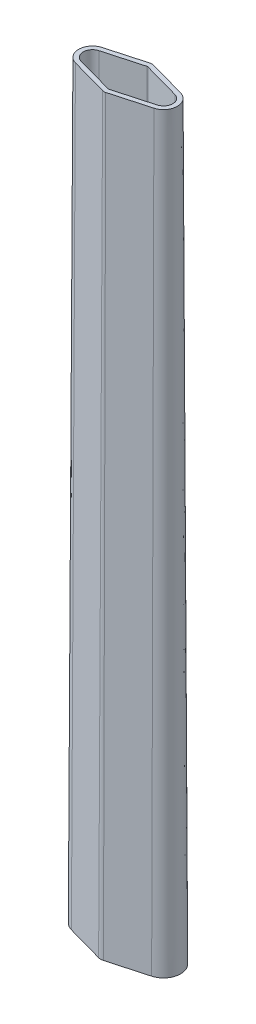
ISO-10303-21;
HEADER;
FILE_DESCRIPTION(('STEP AP214'),'2;1');
FILE_NAME('part.step','',(''),(''),'','','');
FILE_SCHEMA(('AUTOMOTIVE_DESIGN { 1 0 10303 214 1 1 1 1 }'));
ENDSEC;
DATA;
#1=APPLICATION_CONTEXT('core data for automotive mechanical design processes');
#2=APPLICATION_PROTOCOL_DEFINITION('international standard','automotive_design',2000,#1);
#3=PRODUCT_CONTEXT('',#1,'mechanical');
#4=PRODUCT('Part','Part','',(#3));
#5=PRODUCT_RELATED_PRODUCT_CATEGORY('part','',(#4));
#6=PRODUCT_DEFINITION_FORMATION('','',#4);
#7=PRODUCT_DEFINITION_CONTEXT('part definition',#1,'design');
#8=PRODUCT_DEFINITION('design','',#6,#7);
#9=PRODUCT_DEFINITION_SHAPE('','',#8);
#10=(LENGTH_UNIT() NAMED_UNIT(*) SI_UNIT(.MILLI.,.METRE.));
#11=(NAMED_UNIT(*) PLANE_ANGLE_UNIT() SI_UNIT($,.RADIAN.));
#12=(NAMED_UNIT(*) SI_UNIT($,.STERADIAN.) SOLID_ANGLE_UNIT());
#13=UNCERTAINTY_MEASURE_WITH_UNIT(LENGTH_MEASURE(1.E-05),#10,'distance_accuracy_value','');
#14=(GEOMETRIC_REPRESENTATION_CONTEXT(3) GLOBAL_UNCERTAINTY_ASSIGNED_CONTEXT((#13)) GLOBAL_UNIT_ASSIGNED_CONTEXT((#10,
#11,#12)) REPRESENTATION_CONTEXT('',''));
#15=CARTESIAN_POINT('',(0.,0.,0.));
#16=DIRECTION('',(0.,0.,1.));
#17=DIRECTION('',(1.,0.,0.));
#18=AXIS2_PLACEMENT_3D('',#15,#16,#17);
#19=CARTESIAN_POINT('',(11.85,0.,0.));
#20=DIRECTION('',(0.,-1.,0.));
#21=DIRECTION('',(0.,0.,1.));
#22=AXIS2_PLACEMENT_3D('',#19,#20,#21);
#23=CONICAL_SURFACE('',#22,5.7,0.00436332312998583);
#24=CARTESIAN_POINT('',(11.85,0.,0.));
#25=DIRECTION('',(0.,1.,0.));
#26=DIRECTION('',(0.,0.,1.));
#27=AXIS2_PLACEMENT_3D('',#24,#25,#26);
#28=CIRCLE('',#27,5.7);
#29=CARTESIAN_POINT('',(13.3780440472757,0.,5.49136425577335));
#30=VERTEX_POINT('',#29);
#31=CARTESIAN_POINT('',(13.3780440472757,0.,-5.49136425577335));
#32=VERTEX_POINT('',#31);
#33=EDGE_CURVE('E230',#30,#32,#28,.T.);
#34=ORIENTED_EDGE('',*,*,#33,.T.);
#35=DIRECTION('',(0.00116970680332982,-0.999990480720734,-0.00420360011283182));
#36=VECTOR('',#35,1.);
#37=CARTESIAN_POINT('',(13.3780440472757,0.,-5.49136425577335));
#38=LINE('',#37,#36);
#39=CARTESIAN_POINT('',(13.0856145627254,250.,-4.44045422365932));
#40=VERTEX_POINT('',#39);
#41=EDGE_CURVE('E11',#40,#32,#38,.T.);
#42=ORIENTED_EDGE('',*,*,#41,.F.);
#43=CARTESIAN_POINT('',(11.85,250.,0.));
#44=DIRECTION('',(0.,1.,0.));
#45=DIRECTION('',(0.,0.,1.));
#46=AXIS2_PLACEMENT_3D('',#43,#44,#45);
#47=CIRCLE('',#46,4.60916229482461);
#48=CARTESIAN_POINT('',(13.0856145627254,250.,4.44045422365932));
#49=VERTEX_POINT('',#48);
#50=EDGE_CURVE('E254',#49,#40,#47,.T.);
#51=ORIENTED_EDGE('',*,*,#50,.F.);
#52=DIRECTION('',(0.00116970680332982,-0.999990480720734,0.00420360011283182));
#53=VECTOR('',#52,1.);
#54=CARTESIAN_POINT('',(13.3780440472757,0.,5.49136425577335));
#55=LINE('',#54,#53);
#56=EDGE_CURVE('E256',#49,#30,#55,.T.);
#57=ORIENTED_EDGE('',*,*,#56,.T.);
#58=EDGE_LOOP('',(#34,#42,#51,#57));
#59=FACE_BOUND('',#58,.T.);
#60=ADVANCED_FACE('F43',(#59),#23,.T.);
#61=CARTESIAN_POINT('',(0.804233709092491,0.,-8.99019171356492));
#62=DIRECTION('',(0.268075351122407,0.00436330928474658,-0.963388067007623));
#63=DIRECTION('',(-0.963397237854974,0.,-0.26807790303083));
#64=AXIS2_PLACEMENT_3D('',#61,#62,#63);
#65=PLANE('',#64);
#66=DIRECTION('',(-0.963397237854974,0.,-0.26807790303083));
#67=VECTOR('',#66,1.);
#68=CARTESIAN_POINT('',(0.804233709092491,0.,-8.99019171356492));
#69=LINE('',#68,#67);
#70=CARTESIAN_POINT('',(0.804233709092491,0.,-8.99019171356492));
#71=VERTEX_POINT('',#70);
#72=EDGE_CURVE('E234',#32,#71,#69,.T.);
#73=ORIENTED_EDGE('',*,*,#72,.T.);
#74=DIRECTION('',(0.00116970680332981,-0.999990480720734,-0.00420360011283182));
#75=VECTOR('',#74,1.);
#76=CARTESIAN_POINT('',(0.80423370909249,0.,-8.99019171356492));
#77=LINE('',#76,#75);
#78=CARTESIAN_POINT('',(0.511804224542108,250.,-7.93928168145089));
#79=VERTEX_POINT('',#78);
#80=EDGE_CURVE('E53',#79,#71,#77,.T.);
#81=ORIENTED_EDGE('',*,*,#80,.F.);
#82=DIRECTION('',(0.963397237854974,0.,0.26807790303083));
#83=VECTOR('',#82,1.);
#84=CARTESIAN_POINT('',(0.511804224542108,250.,-7.93928168145089));
#85=LINE('',#84,#83);
#86=EDGE_CURVE('E286',#40,#79,#85,.F.);
#87=ORIENTED_EDGE('',*,*,#86,.F.);
#88=ORIENTED_EDGE('',*,*,#41,.T.);
#89=EDGE_LOOP('',(#73,#81,#87,#88));
#90=FACE_BOUND('',#89,.T.);
#91=ADVANCED_FACE('F45',(#90),#65,.T.);
#92=CARTESIAN_POINT('',(0.,0.,-6.1));
#93=DIRECTION('',(0.,-1.,0.));
#94=DIRECTION('',(0.,0.,1.));
#95=AXIS2_PLACEMENT_3D('',#92,#93,#94);
#96=CONICAL_SURFACE('',#95,3.,0.00436332312998583);
#97=CARTESIAN_POINT('',(0.,0.,-6.1));
#98=DIRECTION('',(0.,1.,0.));
#99=DIRECTION('',(0.,0.,1.));
#100=AXIS2_PLACEMENT_3D('',#97,#98,#99);
#101=CIRCLE('',#100,3.);
#102=CARTESIAN_POINT('',(-0.804233709092491,0.,-8.99019171356492));
#103=VERTEX_POINT('',#102);
#104=EDGE_CURVE('E237',#71,#103,#101,.T.);
#105=ORIENTED_EDGE('',*,*,#104,.T.);
#106=DIRECTION('',(-0.00116970680332982,-0.999990480720734,-0.00420360011283182));
#107=VECTOR('',#106,1.);
#108=CARTESIAN_POINT('',(-0.804233709092488,0.,-8.99019171356493));
#109=LINE('',#108,#107);
#110=CARTESIAN_POINT('',(-0.511804224542105,250.,-7.93928168145089));
#111=VERTEX_POINT('',#110);
#112=EDGE_CURVE('E276',#111,#103,#109,.T.);
#113=ORIENTED_EDGE('',*,*,#112,.F.);
#114=CARTESIAN_POINT('',(0.,250.,-6.1));
#115=DIRECTION('',(0.,1.,0.));
#116=DIRECTION('',(0.,0.,1.));
#117=AXIS2_PLACEMENT_3D('',#114,#115,#116);
#118=CIRCLE('',#117,1.90916229482461);
#119=EDGE_CURVE('E289',#79,#111,#118,.T.);
#120=ORIENTED_EDGE('',*,*,#119,.F.);
#121=ORIENTED_EDGE('',*,*,#80,.T.);
#122=EDGE_LOOP('',(#105,#113,#120,#121));
#123=FACE_BOUND('',#122,.T.);
#124=ADVANCED_FACE('F323',(#123),#96,.T.);
#125=CARTESIAN_POINT('',(-13.3780440472757,0.,-5.49136425577335));
#126=DIRECTION('',(-0.268075351122407,0.00436330928474658,-0.963388067007623));
#127=DIRECTION('',(-0.963397237854974,0.,0.26807790303083));
#128=AXIS2_PLACEMENT_3D('',#125,#126,#127);
#129=PLANE('',#128);
#130=DIRECTION('',(-0.963397237854974,0.,0.26807790303083));
#131=VECTOR('',#130,1.);
#132=CARTESIAN_POINT('',(-13.3780440472757,0.,-5.49136425577335));
#133=LINE('',#132,#131);
#134=CARTESIAN_POINT('',(-13.3780440472757,0.,-5.49136425577335));
#135=VERTEX_POINT('',#134);
#136=EDGE_CURVE('E240',#103,#135,#133,.T.);
#137=ORIENTED_EDGE('',*,*,#136,.T.);
#138=DIRECTION('',(-0.00116970680332981,-0.999990480720734,-0.00420360011283182));
#139=VECTOR('',#138,1.);
#140=CARTESIAN_POINT('',(-13.3780440472757,0.,-5.49136425577335));
#141=LINE('',#140,#139);
#142=CARTESIAN_POINT('',(-13.0856145627253,250.,-4.44045422365932));
#143=VERTEX_POINT('',#142);
#144=EDGE_CURVE('E272',#143,#135,#141,.T.);
#145=ORIENTED_EDGE('',*,*,#144,.F.);
#146=DIRECTION('',(0.963397237854974,0.,-0.26807790303083));
#147=VECTOR('',#146,1.);
#148=CARTESIAN_POINT('',(-13.0856145627253,250.,-4.44045422365932));
#149=LINE('',#148,#147);
#150=EDGE_CURVE('E292',#111,#143,#149,.F.);
#151=ORIENTED_EDGE('',*,*,#150,.F.);
#152=ORIENTED_EDGE('',*,*,#112,.T.);
#153=EDGE_LOOP('',(#137,#145,#151,#152));
#154=FACE_BOUND('',#153,.T.);
#155=ADVANCED_FACE('F327',(#154),#129,.T.);
#156=CARTESIAN_POINT('',(-11.85,0.,0.));
#157=DIRECTION('',(0.,-1.,0.));
#158=DIRECTION('',(0.,0.,-1.));
#159=AXIS2_PLACEMENT_3D('',#156,#157,#158);
#160=CONICAL_SURFACE('',#159,5.7,0.00436332312998583);
#161=CARTESIAN_POINT('',(-11.85,0.,0.));
#162=DIRECTION('',(0.,1.,0.));
#163=DIRECTION('',(0.,0.,-1.));
#164=AXIS2_PLACEMENT_3D('',#161,#162,#163);
#165=CIRCLE('',#164,5.7);
#166=CARTESIAN_POINT('',(-13.3780440472757,0.,5.49136425577335));
#167=VERTEX_POINT('',#166);
#168=EDGE_CURVE('E243',#135,#167,#165,.T.);
#169=ORIENTED_EDGE('',*,*,#168,.T.);
#170=DIRECTION('',(-0.00116970680332981,-0.999990480720734,0.00420360011283182));
#171=VECTOR('',#170,1.);
#172=CARTESIAN_POINT('',(-13.3780440472757,0.,5.49136425577335));
#173=LINE('',#172,#171);
#174=CARTESIAN_POINT('',(-13.0856145627253,250.,4.44045422365932));
#175=VERTEX_POINT('',#174);
#176=EDGE_CURVE('E268',#175,#167,#173,.T.);
#177=ORIENTED_EDGE('',*,*,#176,.F.);
#178=CARTESIAN_POINT('',(-11.85,250.,0.));
#179=DIRECTION('',(0.,1.,0.));
#180=DIRECTION('',(0.,0.,1.));
#181=AXIS2_PLACEMENT_3D('',#178,#179,#180);
#182=CIRCLE('',#181,4.60916229482461);
#183=EDGE_CURVE('E295',#143,#175,#182,.T.);
#184=ORIENTED_EDGE('',*,*,#183,.F.);
#185=ORIENTED_EDGE('',*,*,#144,.T.);
#186=EDGE_LOOP('',(#169,#177,#184,#185));
#187=FACE_BOUND('',#186,.T.);
#188=ADVANCED_FACE('F332',(#187),#160,.T.);
#189=CARTESIAN_POINT('',(-0.804233709092491,0.,8.99019171356492));
#190=DIRECTION('',(-0.268075351122406,0.00436330928474658,0.963388067007623));
#191=DIRECTION('',(0.963397237854974,0.,0.26807790303083));
#192=AXIS2_PLACEMENT_3D('',#189,#190,#191);
#193=PLANE('',#192);
#194=DIRECTION('',(0.963397237854974,0.,0.26807790303083));
#195=VECTOR('',#194,1.);
#196=CARTESIAN_POINT('',(-0.804233709092491,0.,8.99019171356492));
#197=LINE('',#196,#195);
#198=CARTESIAN_POINT('',(-0.80423370909249,0.,8.99019171356492));
#199=VERTEX_POINT('',#198);
#200=EDGE_CURVE('E246',#167,#199,#197,.T.);
#201=ORIENTED_EDGE('',*,*,#200,.T.);
#202=DIRECTION('',(-0.00116970680332981,-0.999990480720734,0.00420360011283182));
#203=VECTOR('',#202,1.);
#204=CARTESIAN_POINT('',(-0.804233709092489,0.,8.99019171356492));
#205=LINE('',#204,#203);
#206=CARTESIAN_POINT('',(-0.511804224542107,250.,7.93928168145089));
#207=VERTEX_POINT('',#206);
#208=EDGE_CURVE('E264',#207,#199,#205,.T.);
#209=ORIENTED_EDGE('',*,*,#208,.F.);
#210=DIRECTION('',(-0.963397237854974,0.,-0.26807790303083));
#211=VECTOR('',#210,1.);
#212=CARTESIAN_POINT('',(-0.511804224542108,250.,7.93928168145089));
#213=LINE('',#212,#211);
#214=EDGE_CURVE('E298',#175,#207,#213,.F.);
#215=ORIENTED_EDGE('',*,*,#214,.F.);
#216=ORIENTED_EDGE('',*,*,#176,.T.);
#217=EDGE_LOOP('',(#201,#209,#215,#216));
#218=FACE_BOUND('',#217,.T.);
#219=ADVANCED_FACE('F336',(#218),#193,.T.);
#220=CARTESIAN_POINT('',(0.,0.,6.1));
#221=DIRECTION('',(0.,-1.,0.));
#222=DIRECTION('',(0.,0.,-1.));
#223=AXIS2_PLACEMENT_3D('',#220,#221,#222);
#224=CONICAL_SURFACE('',#223,3.,0.00436332312998583);
#225=CARTESIAN_POINT('',(0.,0.,6.1));
#226=DIRECTION('',(0.,1.,0.));
#227=DIRECTION('',(0.,0.,-1.));
#228=AXIS2_PLACEMENT_3D('',#225,#226,#227);
#229=CIRCLE('',#228,3.);
#230=CARTESIAN_POINT('',(0.804233709092491,0.,8.99019171356492));
#231=VERTEX_POINT('',#230);
#232=EDGE_CURVE('E249',#199,#231,#229,.T.);
#233=ORIENTED_EDGE('',*,*,#232,.T.);
#234=DIRECTION('',(0.00116970680332981,-0.999990480720734,0.00420360011283182));
#235=VECTOR('',#234,1.);
#236=CARTESIAN_POINT('',(0.804233709092493,0.,8.99019171356492));
#237=LINE('',#236,#235);
#238=CARTESIAN_POINT('',(0.51180422454211,250.,7.93928168145089));
#239=VERTEX_POINT('',#238);
#240=EDGE_CURVE('E260',#239,#231,#237,.T.);
#241=ORIENTED_EDGE('',*,*,#240,.F.);
#242=CARTESIAN_POINT('',(0.,250.,6.1));
#243=DIRECTION('',(0.,1.,0.));
#244=DIRECTION('',(0.,0.,1.));
#245=AXIS2_PLACEMENT_3D('',#242,#243,#244);
#246=CIRCLE('',#245,1.90916229482461);
#247=EDGE_CURVE('E300',#207,#239,#246,.T.);
#248=ORIENTED_EDGE('',*,*,#247,.F.);
#249=ORIENTED_EDGE('',*,*,#208,.T.);
#250=EDGE_LOOP('',(#233,#241,#248,#249));
#251=FACE_BOUND('',#250,.T.);
#252=ADVANCED_FACE('F340',(#251),#224,.T.);
#253=CARTESIAN_POINT('',(13.3780440472757,0.,5.49136425577335));
#254=DIRECTION('',(0.268075351122406,0.00436330928474658,0.963388067007623));
#255=DIRECTION('',(0.963397237854974,0.,-0.26807790303083));
#256=AXIS2_PLACEMENT_3D('',#253,#254,#255);
#257=PLANE('',#256);
#258=DIRECTION('',(0.963397237854974,0.,-0.26807790303083));
#259=VECTOR('',#258,1.);
#260=CARTESIAN_POINT('',(13.3780440472757,0.,5.49136425577335));
#261=LINE('',#260,#259);
#262=EDGE_CURVE('E252',#231,#30,#261,.T.);
#263=ORIENTED_EDGE('',*,*,#262,.T.);
#264=ORIENTED_EDGE('',*,*,#56,.F.);
#265=DIRECTION('',(-0.963397237854974,0.,0.26807790303083));
#266=VECTOR('',#265,1.);
#267=CARTESIAN_POINT('',(13.0856145627254,250.,4.44045422365932));
#268=LINE('',#267,#266);
#269=EDGE_CURVE('E47',#239,#49,#268,.F.);
#270=ORIENTED_EDGE('',*,*,#269,.F.);
#271=ORIENTED_EDGE('',*,*,#240,.T.);
#272=EDGE_LOOP('',(#263,#264,#270,#271));
#273=FACE_BOUND('',#272,.T.);
#274=ADVANCED_FACE('F312',(#273),#257,.T.);
#275=CARTESIAN_POINT('',(11.85,250.,0.));
#276=DIRECTION('',(0.,1.,0.));
#277=DIRECTION('',(0.,0.,1.));
#278=AXIS2_PLACEMENT_3D('',#275,#276,#277);
#279=PLANE('',#278);
#280=CARTESIAN_POINT('',(11.85,250.,0.));
#281=DIRECTION('',(0.,1.,0.));
#282=DIRECTION('',(0.,0.,1.));
#283=AXIS2_PLACEMENT_3D('',#280,#281,#282);
#284=CIRCLE('',#283,3.10914801576979);
#285=CARTESIAN_POINT('',(12.68349388028,250.,2.99534461047488));
#286=VERTEX_POINT('',#285);
#287=CARTESIAN_POINT('',(12.68349388028,250.,-2.99534461047488));
#288=VERTEX_POINT('',#287);
#289=EDGE_CURVE('E187',#286,#288,#284,.T.);
#290=ORIENTED_EDGE('',*,*,#289,.F.);
#291=DIRECTION('',(-0.963397237854974,0.,0.26807790303083));
#292=VECTOR('',#291,1.);
#293=CARTESIAN_POINT('',(12.68349388028,250.,2.99534461047488));
#294=LINE('',#293,#292);
#295=CARTESIAN_POINT('',(0.10968354209679,250.,6.49417206826645));
#296=VERTEX_POINT('',#295);
#297=EDGE_CURVE('E165',#296,#286,#294,.F.);
#298=ORIENTED_EDGE('',*,*,#297,.F.);
#299=CARTESIAN_POINT('',(0.,250.,6.1));
#300=DIRECTION('',(0.,1.,0.));
#301=DIRECTION('',(0.,0.,1.));
#302=AXIS2_PLACEMENT_3D('',#299,#300,#301);
#303=CIRCLE('',#302,0.409148015769783);
#304=CARTESIAN_POINT('',(-0.109683542096788,250.,6.49417206826645));
#305=VERTEX_POINT('',#304);
#306=EDGE_CURVE('E225',#305,#296,#303,.T.);
#307=ORIENTED_EDGE('',*,*,#306,.F.);
#308=DIRECTION('',(-0.963397237854974,0.,-0.26807790303083));
#309=VECTOR('',#308,1.);
#310=CARTESIAN_POINT('',(-0.109683542096789,250.,6.49417206826645));
#311=LINE('',#310,#309);
#312=CARTESIAN_POINT('',(-12.68349388028,250.,2.99534461047488));
#313=VERTEX_POINT('',#312);
#314=EDGE_CURVE('E222',#313,#305,#311,.F.);
#315=ORIENTED_EDGE('',*,*,#314,.F.);
#316=CARTESIAN_POINT('',(-11.85,250.,0.));
#317=DIRECTION('',(0.,1.,0.));
#318=DIRECTION('',(0.,0.,1.));
#319=AXIS2_PLACEMENT_3D('',#316,#317,#318);
#320=CIRCLE('',#319,3.10914801576979);
#321=CARTESIAN_POINT('',(-12.68349388028,250.,-2.99534461047488));
#322=VERTEX_POINT('',#321);
#323=EDGE_CURVE('E219',#322,#313,#320,.T.);
#324=ORIENTED_EDGE('',*,*,#323,.F.);
#325=DIRECTION('',(0.963397237854974,0.,-0.26807790303083));
#326=VECTOR('',#325,1.);
#327=CARTESIAN_POINT('',(-12.68349388028,250.,-2.99534461047488));
#328=LINE('',#327,#326);
#329=CARTESIAN_POINT('',(-0.109683542096783,250.,-6.49417206826646));
#330=VERTEX_POINT('',#329);
#331=EDGE_CURVE('E216',#330,#322,#328,.F.);
#332=ORIENTED_EDGE('',*,*,#331,.F.);
#333=CARTESIAN_POINT('',(0.,250.,-6.1));
#334=DIRECTION('',(0.,1.,0.));
#335=DIRECTION('',(0.,0.,1.));
#336=AXIS2_PLACEMENT_3D('',#333,#334,#335);
#337=CIRCLE('',#336,0.409148015769783);
#338=CARTESIAN_POINT('',(0.109683542096788,250.,-6.49417206826645));
#339=VERTEX_POINT('',#338);
#340=EDGE_CURVE('E213',#339,#330,#337,.T.);
#341=ORIENTED_EDGE('',*,*,#340,.F.);
#342=DIRECTION('',(0.963397237854974,0.,0.26807790303083));
#343=VECTOR('',#342,1.);
#344=CARTESIAN_POINT('',(0.109683542096788,250.,-6.49417206826645));
#345=LINE('',#344,#343);
#346=EDGE_CURVE('E191',#288,#339,#345,.F.);
#347=ORIENTED_EDGE('',*,*,#346,.F.);
#348=EDGE_LOOP('',(#290,#298,#307,#315,#324,#332,#341,#347));
#349=FACE_BOUND('',#348,.T.);
#350=ORIENTED_EDGE('',*,*,#50,.T.);
#351=ORIENTED_EDGE('',*,*,#86,.T.);
#352=ORIENTED_EDGE('',*,*,#119,.T.);
#353=ORIENTED_EDGE('',*,*,#150,.T.);
#354=ORIENTED_EDGE('',*,*,#183,.T.);
#355=ORIENTED_EDGE('',*,*,#214,.T.);
#356=ORIENTED_EDGE('',*,*,#247,.T.);
#357=ORIENTED_EDGE('',*,*,#269,.T.);
#358=EDGE_LOOP('',(#350,#351,#352,#353,#354,#355,#356,#357));
#359=FACE_BOUND('',#358,.T.);
#360=ADVANCED_FACE('F308',(#349,#359),#279,.T.);
#361=CARTESIAN_POINT('',(11.85,0.,0.));
#362=DIRECTION('',(0.,1.,0.));
#363=DIRECTION('',(0.,0.,1.));
#364=AXIS2_PLACEMENT_3D('',#361,#362,#363);
#365=PLANE('',#364);
#366=DIRECTION('',(-0.963397237854974,0.,0.26807790303083));
#367=VECTOR('',#366,1.);
#368=CARTESIAN_POINT('',(12.9759233648304,0.,4.04625464258892));
#369=LINE('',#368,#367);
#370=CARTESIAN_POINT('',(0.402113026647173,0.,7.54508210038049));
#371=VERTEX_POINT('',#370);
#372=CARTESIAN_POINT('',(12.9759233648304,0.,4.04625464258892));
#373=VERTEX_POINT('',#372);
#374=EDGE_CURVE('E162',#371,#373,#369,.F.);
#375=ORIENTED_EDGE('',*,*,#374,.T.);
#376=CARTESIAN_POINT('',(11.85,0.,0.));
#377=DIRECTION('',(0.,1.,0.));
#378=DIRECTION('',(0.,0.,1.));
#379=AXIS2_PLACEMENT_3D('',#376,#377,#378);
#380=CIRCLE('',#379,4.19998572094518);
#381=CARTESIAN_POINT('',(12.9759233648304,0.,-4.04625464258891));
#382=VERTEX_POINT('',#381);
#383=EDGE_CURVE('E172',#373,#382,#380,.T.);
#384=ORIENTED_EDGE('',*,*,#383,.T.);
#385=DIRECTION('',(0.963397237854974,0.,0.26807790303083));
#386=VECTOR('',#385,1.);
#387=CARTESIAN_POINT('',(0.402113026647171,0.,-7.54508210038049));
#388=LINE('',#387,#386);
#389=CARTESIAN_POINT('',(0.40211302664717,0.,-7.54508210038049));
#390=VERTEX_POINT('',#389);
#391=EDGE_CURVE('E179',#382,#390,#388,.F.);
#392=ORIENTED_EDGE('',*,*,#391,.T.);
#393=CARTESIAN_POINT('',(0.,0.,-6.1));
#394=DIRECTION('',(0.,1.,0.));
#395=DIRECTION('',(0.,0.,1.));
#396=AXIS2_PLACEMENT_3D('',#393,#394,#395);
#397=CIRCLE('',#396,1.49998572094518);
#398=CARTESIAN_POINT('',(-0.402113026647166,0.,-7.54508210038049));
#399=VERTEX_POINT('',#398);
#400=EDGE_CURVE('E69',#390,#399,#397,.T.);
#401=ORIENTED_EDGE('',*,*,#400,.T.);
#402=DIRECTION('',(0.963397237854974,0.,-0.26807790303083));
#403=VECTOR('',#402,1.);
#404=CARTESIAN_POINT('',(-12.9759233648304,0.,-4.04625464258891));
#405=LINE('',#404,#403);
#406=CARTESIAN_POINT('',(-12.9759233648304,0.,-4.04625464258892));
#407=VERTEX_POINT('',#406);
#408=EDGE_CURVE('E203',#399,#407,#405,.F.);
#409=ORIENTED_EDGE('',*,*,#408,.T.);
#410=CARTESIAN_POINT('',(-11.85,0.,0.));
#411=DIRECTION('',(0.,1.,0.));
#412=DIRECTION('',(0.,0.,1.));
#413=AXIS2_PLACEMENT_3D('',#410,#411,#412);
#414=CIRCLE('',#413,4.19998572094518);
#415=CARTESIAN_POINT('',(-12.9759233648304,0.,4.04625464258892));
#416=VERTEX_POINT('',#415);
#417=EDGE_CURVE('E199',#407,#416,#414,.T.);
#418=ORIENTED_EDGE('',*,*,#417,.T.);
#419=DIRECTION('',(-0.963397237854974,0.,-0.26807790303083));
#420=VECTOR('',#419,1.);
#421=CARTESIAN_POINT('',(-0.402113026647171,0.,7.54508210038049));
#422=LINE('',#421,#420);
#423=CARTESIAN_POINT('',(-0.40211302664717,0.,7.54508210038049));
#424=VERTEX_POINT('',#423);
#425=EDGE_CURVE('E193',#416,#424,#422,.F.);
#426=ORIENTED_EDGE('',*,*,#425,.T.);
#427=CARTESIAN_POINT('',(0.,0.,6.1));
#428=DIRECTION('',(0.,1.,0.));
#429=DIRECTION('',(0.,0.,1.));
#430=AXIS2_PLACEMENT_3D('',#427,#428,#429);
#431=CIRCLE('',#430,1.49998572094518);
#432=EDGE_CURVE('E185',#424,#371,#431,.T.);
#433=ORIENTED_EDGE('',*,*,#432,.T.);
#434=EDGE_LOOP('',(#375,#384,#392,#401,#409,#418,#426,#433));
#435=FACE_BOUND('',#434,.T.);
#436=ORIENTED_EDGE('',*,*,#33,.F.);
#437=ORIENTED_EDGE('',*,*,#262,.F.);
#438=ORIENTED_EDGE('',*,*,#232,.F.);
#439=ORIENTED_EDGE('',*,*,#200,.F.);
#440=ORIENTED_EDGE('',*,*,#168,.F.);
#441=ORIENTED_EDGE('',*,*,#136,.F.);
#442=ORIENTED_EDGE('',*,*,#104,.F.);
#443=ORIENTED_EDGE('',*,*,#72,.F.);
#444=EDGE_LOOP('',(#436,#437,#438,#439,#440,#441,#442,#443));
#445=FACE_BOUND('',#444,.T.);
#446=ADVANCED_FACE('F181',(#435,#445),#365,.F.);
#447=CARTESIAN_POINT('',(11.85,-0.00654496392711987,0.));
#448=DIRECTION('',(0.,-1.,0.));
#449=DIRECTION('',(0.,0.,1.));
#450=AXIS2_PLACEMENT_3D('',#447,#448,#449);
#451=CONICAL_SURFACE('',#450,4.2000142789189,0.00436332312998583);
#452=ORIENTED_EDGE('',*,*,#383,.F.);
#453=DIRECTION('',(0.00116970680332982,-0.999990480720734,0.00420360011283182));
#454=VECTOR('',#453,1.);
#455=CARTESIAN_POINT('',(12.9759310205921,-0.00654496392711987,4.04628215526192));
#456=LINE('',#455,#454);
#457=EDGE_CURVE('E158',#286,#373,#456,.T.);
#458=ORIENTED_EDGE('',*,*,#457,.F.);
#459=ORIENTED_EDGE('',*,*,#289,.T.);
#460=DIRECTION('',(-0.00116970680332982,0.999990480720735,0.00420360011283182));
#461=VECTOR('',#460,1.);
#462=CARTESIAN_POINT('',(12.9759310205921,-0.00654496392711987,-4.04628215526192));
#463=LINE('',#462,#461);
#464=EDGE_CURVE('E175',#288,#382,#463,.F.);
#465=ORIENTED_EDGE('',*,*,#464,.T.);
#466=EDGE_LOOP('',(#452,#458,#459,#465));
#467=FACE_BOUND('',#466,.T.);
#468=ADVANCED_FACE('F173',(#467),#451,.F.);
#469=CARTESIAN_POINT('',(0.402120682408881,-0.00654496392711987,-7.54510961305349));
#470=DIRECTION('',(0.268075351122407,0.00436330928474658,-0.963388067007623));
#471=DIRECTION('',(-0.963397237854974,0.,-0.26807790303083));
#472=AXIS2_PLACEMENT_3D('',#469,#470,#471);
#473=PLANE('',#472);
#474=ORIENTED_EDGE('',*,*,#391,.F.);
#475=ORIENTED_EDGE('',*,*,#464,.F.);
#476=ORIENTED_EDGE('',*,*,#346,.T.);
#477=DIRECTION('',(0.00116970680332981,-0.999990480720734,-0.00420360011283182));
#478=VECTOR('',#477,1.);
#479=CARTESIAN_POINT('',(0.402120682408881,-0.00654496392711987,-7.54510961305349));
#480=LINE('',#479,#478);
#481=EDGE_CURVE('E551',#339,#390,#480,.T.);
#482=ORIENTED_EDGE('',*,*,#481,.T.);
#483=EDGE_LOOP('',(#474,#475,#476,#482));
#484=FACE_BOUND('',#483,.T.);
#485=ADVANCED_FACE('F347',(#484),#473,.F.);
#486=CARTESIAN_POINT('',(0.,-0.00654496392711987,-6.1));
#487=DIRECTION('',(0.,-1.,0.));
#488=DIRECTION('',(0.,0.,1.));
#489=AXIS2_PLACEMENT_3D('',#486,#487,#488);
#490=CONICAL_SURFACE('',#489,1.5000142789189,0.00436332312998583);
#491=ORIENTED_EDGE('',*,*,#400,.F.);
#492=ORIENTED_EDGE('',*,*,#481,.F.);
#493=ORIENTED_EDGE('',*,*,#340,.T.);
#494=DIRECTION('',(0.00116970680332982,0.999990480720735,0.00420360011283182));
#495=VECTOR('',#494,1.);
#496=CARTESIAN_POINT('',(-0.402120682408877,-0.00654496392711987,-7.54510961305349));
#497=LINE('',#496,#495);
#498=EDGE_CURVE('E548',#330,#399,#497,.F.);
#499=ORIENTED_EDGE('',*,*,#498,.T.);
#500=EDGE_LOOP('',(#491,#492,#493,#499));
#501=FACE_BOUND('',#500,.T.);
#502=ADVANCED_FACE('F417',(#501),#490,.F.);
#503=CARTESIAN_POINT('',(-12.9759310205921,-0.00654496392711987,-4.04628215526192));
#504=DIRECTION('',(-0.268075351122407,0.00436330928474658,-0.963388067007623));
#505=DIRECTION('',(-0.963397237854974,0.,0.26807790303083));
#506=AXIS2_PLACEMENT_3D('',#503,#504,#505);
#507=PLANE('',#506);
#508=ORIENTED_EDGE('',*,*,#408,.F.);
#509=ORIENTED_EDGE('',*,*,#498,.F.);
#510=ORIENTED_EDGE('',*,*,#331,.T.);
#511=DIRECTION('',(-0.00116970680332981,-0.999990480720734,-0.00420360011283182));
#512=VECTOR('',#511,1.);
#513=CARTESIAN_POINT('',(-12.9759310205921,-0.00654496392711987,-4.04628215526192));
#514=LINE('',#513,#512);
#515=EDGE_CURVE('E543',#322,#407,#514,.T.);
#516=ORIENTED_EDGE('',*,*,#515,.T.);
#517=EDGE_LOOP('',(#508,#509,#510,#516));
#518=FACE_BOUND('',#517,.T.);
#519=ADVANCED_FACE('F428',(#518),#507,.F.);
#520=CARTESIAN_POINT('',(-11.85,-0.00654496392711987,0.));
#521=DIRECTION('',(0.,-1.,0.));
#522=DIRECTION('',(0.,0.,-1.));
#523=AXIS2_PLACEMENT_3D('',#520,#521,#522);
#524=CONICAL_SURFACE('',#523,4.2000142789189,0.00436332312998583);
#525=ORIENTED_EDGE('',*,*,#417,.F.);
#526=ORIENTED_EDGE('',*,*,#515,.F.);
#527=ORIENTED_EDGE('',*,*,#323,.T.);
#528=DIRECTION('',(0.00116970680332981,0.999990480720734,-0.00420360011283182));
#529=VECTOR('',#528,1.);
#530=CARTESIAN_POINT('',(-12.9759310205921,-0.00654496392711987,4.04628215526192));
#531=LINE('',#530,#529);
#532=EDGE_CURVE('E537',#313,#416,#531,.F.);
#533=ORIENTED_EDGE('',*,*,#532,.T.);
#534=EDGE_LOOP('',(#525,#526,#527,#533));
#535=FACE_BOUND('',#534,.T.);
#536=ADVANCED_FACE('F438',(#535),#524,.F.);
#537=CARTESIAN_POINT('',(-0.402120682408882,-0.00654496392711987,7.54510961305349));
#538=DIRECTION('',(-0.268075351122406,0.00436330928474658,0.963388067007623));
#539=DIRECTION('',(0.963397237854974,0.,0.26807790303083));
#540=AXIS2_PLACEMENT_3D('',#537,#538,#539);
#541=PLANE('',#540);
#542=ORIENTED_EDGE('',*,*,#425,.F.);
#543=ORIENTED_EDGE('',*,*,#532,.F.);
#544=ORIENTED_EDGE('',*,*,#314,.T.);
#545=DIRECTION('',(-0.00116970680332981,-0.999990480720734,0.00420360011283182));
#546=VECTOR('',#545,1.);
#547=CARTESIAN_POINT('',(-0.40212068240888,-0.00654496392711987,7.54510961305349));
#548=LINE('',#547,#546);
#549=EDGE_CURVE('E532',#305,#424,#548,.T.);
#550=ORIENTED_EDGE('',*,*,#549,.T.);
#551=EDGE_LOOP('',(#542,#543,#544,#550));
#552=FACE_BOUND('',#551,.T.);
#553=ADVANCED_FACE('F449',(#552),#541,.F.);
#554=CARTESIAN_POINT('',(0.,-0.00654496392711987,6.1));
#555=DIRECTION('',(0.,-1.,0.));
#556=DIRECTION('',(0.,0.,-1.));
#557=AXIS2_PLACEMENT_3D('',#554,#555,#556);
#558=CONICAL_SURFACE('',#557,1.5000142789189,0.00436332312998583);
#559=ORIENTED_EDGE('',*,*,#432,.F.);
#560=ORIENTED_EDGE('',*,*,#549,.F.);
#561=ORIENTED_EDGE('',*,*,#306,.T.);
#562=DIRECTION('',(-0.00116970680332981,0.999990480720734,-0.00420360011283182));
#563=VECTOR('',#562,1.);
#564=CARTESIAN_POINT('',(0.402120682408883,-0.00654496392711987,7.54510961305349));
#565=LINE('',#564,#563);
#566=EDGE_CURVE('E61',#296,#371,#565,.F.);
#567=ORIENTED_EDGE('',*,*,#566,.T.);
#568=EDGE_LOOP('',(#559,#560,#561,#567));
#569=FACE_BOUND('',#568,.T.);
#570=ADVANCED_FACE('F460',(#569),#558,.F.);
#571=CARTESIAN_POINT('',(12.9759310205921,-0.00654496392711987,4.04628215526192));
#572=DIRECTION('',(0.268075351122406,0.00436330928474658,0.963388067007623));
#573=DIRECTION('',(0.963397237854974,0.,-0.26807790303083));
#574=AXIS2_PLACEMENT_3D('',#571,#572,#573);
#575=PLANE('',#574);
#576=ORIENTED_EDGE('',*,*,#374,.F.);
#577=ORIENTED_EDGE('',*,*,#566,.F.);
#578=ORIENTED_EDGE('',*,*,#297,.T.);
#579=ORIENTED_EDGE('',*,*,#457,.T.);
#580=EDGE_LOOP('',(#576,#577,#578,#579));
#581=FACE_BOUND('',#580,.T.);
#582=ADVANCED_FACE('F160',(#581),#575,.F.);
#583=CLOSED_SHELL('',(#60,#91,#124,#155,#188,#219,#252,#274,#360,#446,#468,#485,#502,#519,#536,
#553,#570,#582));
#584=MANIFOLD_SOLID_BREP('B2',#583);
#585=ADVANCED_BREP_SHAPE_REPRESENTATION('',(#18,#584),#14);
#586=SHAPE_DEFINITION_REPRESENTATION(#9,#585);
ENDSEC;
END-ISO-10303-21;
